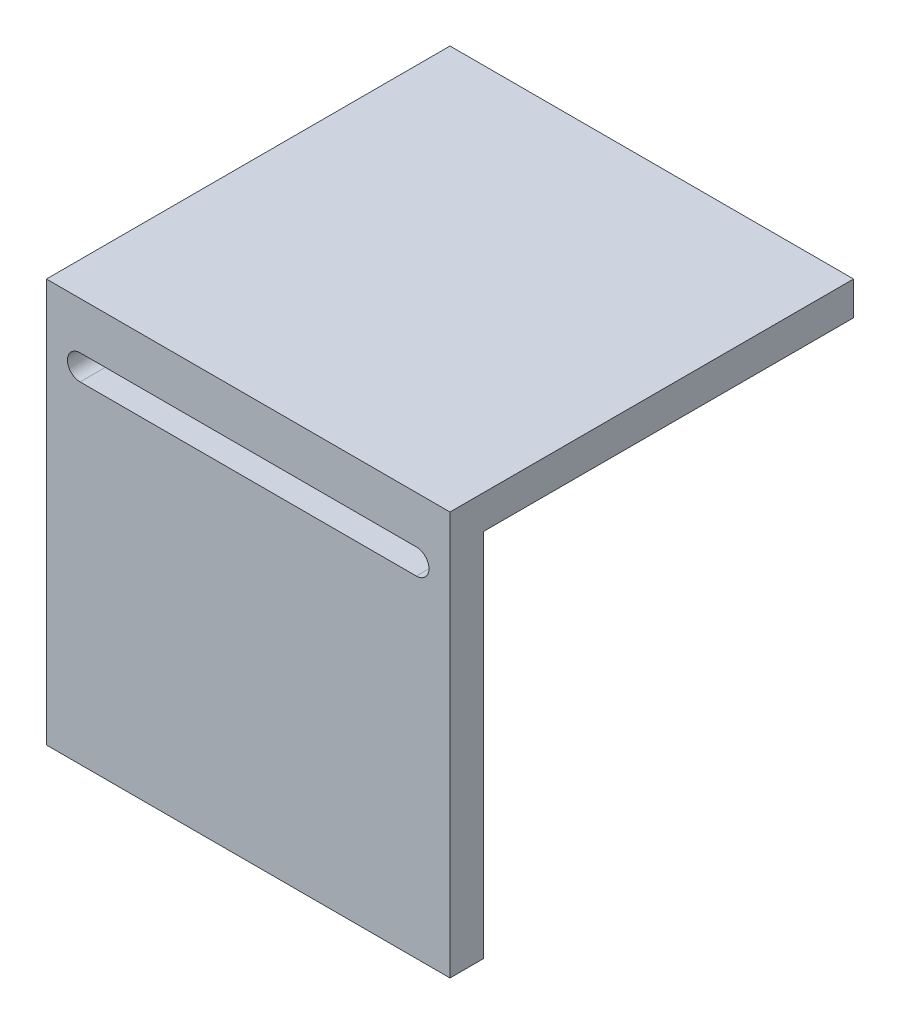
ISO-10303-21;
HEADER;
FILE_DESCRIPTION(('STEP AP214'),'2;1');
FILE_NAME('part.step','',(''),(''),'','','');
FILE_SCHEMA(('AUTOMOTIVE_DESIGN { 1 0 10303 214 1 1 1 1 }'));
ENDSEC;
DATA;
#1=APPLICATION_CONTEXT('core data for automotive mechanical design processes');
#2=APPLICATION_PROTOCOL_DEFINITION('international standard','automotive_design',2000,#1);
#3=PRODUCT_CONTEXT('',#1,'mechanical');
#4=PRODUCT('Part','Part','',(#3));
#5=PRODUCT_RELATED_PRODUCT_CATEGORY('part','',(#4));
#6=PRODUCT_DEFINITION_FORMATION('','',#4);
#7=PRODUCT_DEFINITION_CONTEXT('part definition',#1,'design');
#8=PRODUCT_DEFINITION('design','',#6,#7);
#9=PRODUCT_DEFINITION_SHAPE('','',#8);
#10=(LENGTH_UNIT() NAMED_UNIT(*) SI_UNIT(.MILLI.,.METRE.));
#11=(NAMED_UNIT(*) PLANE_ANGLE_UNIT() SI_UNIT($,.RADIAN.));
#12=(NAMED_UNIT(*) SI_UNIT($,.STERADIAN.) SOLID_ANGLE_UNIT());
#13=UNCERTAINTY_MEASURE_WITH_UNIT(LENGTH_MEASURE(1.E-05),#10,'distance_accuracy_value','');
#14=(GEOMETRIC_REPRESENTATION_CONTEXT(3) GLOBAL_UNCERTAINTY_ASSIGNED_CONTEXT((#13)) GLOBAL_UNIT_ASSIGNED_CONTEXT((#10,
#11,#12)) REPRESENTATION_CONTEXT('',''));
#15=CARTESIAN_POINT('',(0.,0.,0.));
#16=DIRECTION('',(0.,0.,1.));
#17=DIRECTION('',(1.,0.,0.));
#18=AXIS2_PLACEMENT_3D('',#15,#16,#17);
#19=CARTESIAN_POINT('',(76.2,0.,6.35));
#20=DIRECTION('',(0.,0.,-1.));
#21=DIRECTION('',(0.,1.,0.));
#22=AXIS2_PLACEMENT_3D('',#19,#20,#21);
#23=PLANE('',#22);
#24=DIRECTION('',(1.,0.,0.));
#25=VECTOR('',#24,1.);
#26=CARTESIAN_POINT('',(69.85,67.31,6.35));
#27=LINE('',#26,#25);
#28=CARTESIAN_POINT('',(6.35,67.31,6.35));
#29=VERTEX_POINT('',#28);
#30=CARTESIAN_POINT('',(69.85,67.31,6.35));
#31=VERTEX_POINT('',#30);
#32=EDGE_CURVE('E117',#29,#31,#27,.T.);
#33=ORIENTED_EDGE('',*,*,#32,.T.);
#34=CARTESIAN_POINT('',(69.85,64.92875,6.35));
#35=DIRECTION('',(0.,0.,-1.));
#36=DIRECTION('',(0.,1.,0.));
#37=AXIS2_PLACEMENT_3D('',#34,#35,#36);
#38=CIRCLE('',#37,2.38125);
#39=CARTESIAN_POINT('',(69.85,62.5475,6.35));
#40=VERTEX_POINT('',#39);
#41=EDGE_CURVE('E111',#31,#40,#38,.T.);
#42=ORIENTED_EDGE('',*,*,#41,.T.);
#43=DIRECTION('',(-1.,0.,0.));
#44=VECTOR('',#43,1.);
#45=CARTESIAN_POINT('',(69.85,62.5475,6.35));
#46=LINE('',#45,#44);
#47=CARTESIAN_POINT('',(6.35000000000001,62.5475,6.34999999999999));
#48=VERTEX_POINT('',#47);
#49=EDGE_CURVE('E120',#40,#48,#46,.T.);
#50=ORIENTED_EDGE('',*,*,#49,.T.);
#51=CARTESIAN_POINT('',(6.35,64.92875,6.35));
#52=DIRECTION('',(0.,0.,-1.));
#53=DIRECTION('',(0.,1.,0.));
#54=AXIS2_PLACEMENT_3D('',#51,#52,#53);
#55=CIRCLE('',#54,2.38125);
#56=EDGE_CURVE('E47',#48,#29,#55,.T.);
#57=ORIENTED_EDGE('',*,*,#56,.T.);
#58=EDGE_LOOP('',(#33,#42,#50,#57));
#59=FACE_BOUND('',#58,.T.);
#60=DIRECTION('',(0.,-1.,0.));
#61=VECTOR('',#60,1.);
#62=CARTESIAN_POINT('',(0.,0.,6.35));
#63=LINE('',#62,#61);
#64=CARTESIAN_POINT('',(0.,76.2,6.34999999999999));
#65=VERTEX_POINT('',#64);
#66=CARTESIAN_POINT('',(0.,0.,6.35));
#67=VERTEX_POINT('',#66);
#68=EDGE_CURVE('E141',#65,#67,#63,.T.);
#69=ORIENTED_EDGE('',*,*,#68,.T.);
#70=DIRECTION('',(-1.,0.,0.));
#71=VECTOR('',#70,1.);
#72=CARTESIAN_POINT('',(76.2,0.,6.35));
#73=LINE('',#72,#71);
#74=CARTESIAN_POINT('',(76.2,0.,6.35));
#75=VERTEX_POINT('',#74);
#76=EDGE_CURVE('E11',#75,#67,#73,.T.);
#77=ORIENTED_EDGE('',*,*,#76,.F.);
#78=DIRECTION('',(0.,-1.,0.));
#79=VECTOR('',#78,1.);
#80=CARTESIAN_POINT('',(76.2,0.,6.35));
#81=LINE('',#80,#79);
#82=CARTESIAN_POINT('',(76.2,76.2,6.34999999999999));
#83=VERTEX_POINT('',#82);
#84=EDGE_CURVE('E145',#83,#75,#81,.T.);
#85=ORIENTED_EDGE('',*,*,#84,.F.);
#86=DIRECTION('',(-1.,0.,0.));
#87=VECTOR('',#86,1.);
#88=CARTESIAN_POINT('',(76.2,76.2,6.34999999999999));
#89=LINE('',#88,#87);
#90=EDGE_CURVE('E159',#83,#65,#89,.T.);
#91=ORIENTED_EDGE('',*,*,#90,.T.);
#92=EDGE_LOOP('',(#69,#77,#85,#91));
#93=FACE_BOUND('',#92,.T.);
#94=ADVANCED_FACE('F33',(#59,#93),#23,.F.);
#95=CARTESIAN_POINT('',(76.2,0.,0.));
#96=DIRECTION('',(0.,1.,0.));
#97=DIRECTION('',(0.,0.,1.));
#98=AXIS2_PLACEMENT_3D('',#95,#96,#97);
#99=PLANE('',#98);
#100=DIRECTION('',(0.,0.,-1.));
#101=VECTOR('',#100,1.);
#102=CARTESIAN_POINT('',(0.,0.,0.));
#103=LINE('',#102,#101);
#104=CARTESIAN_POINT('',(0.,0.,0.));
#105=VERTEX_POINT('',#104);
#106=EDGE_CURVE('E162',#67,#105,#103,.T.);
#107=ORIENTED_EDGE('',*,*,#106,.T.);
#108=DIRECTION('',(-1.,0.,0.));
#109=VECTOR('',#108,1.);
#110=CARTESIAN_POINT('',(76.2,0.,0.));
#111=LINE('',#110,#109);
#112=CARTESIAN_POINT('',(76.2,0.,0.));
#113=VERTEX_POINT('',#112);
#114=EDGE_CURVE('E40',#113,#105,#111,.T.);
#115=ORIENTED_EDGE('',*,*,#114,.F.);
#116=DIRECTION('',(0.,0.,-1.));
#117=VECTOR('',#116,1.);
#118=CARTESIAN_POINT('',(76.2,0.,0.));
#119=LINE('',#118,#117);
#120=EDGE_CURVE('E148',#75,#113,#119,.T.);
#121=ORIENTED_EDGE('',*,*,#120,.F.);
#122=ORIENTED_EDGE('',*,*,#76,.T.);
#123=EDGE_LOOP('',(#107,#115,#121,#122));
#124=FACE_BOUND('',#123,.T.);
#125=ADVANCED_FACE('F209',(#124),#99,.F.);
#126=CARTESIAN_POINT('',(76.2,69.85,0.));
#127=DIRECTION('',(0.,0.,1.));
#128=DIRECTION('',(0.,-1.,0.));
#129=AXIS2_PLACEMENT_3D('',#126,#127,#128);
#130=PLANE('',#129);
#131=DIRECTION('',(-1.,0.,0.));
#132=VECTOR('',#131,1.);
#133=CARTESIAN_POINT('',(69.85,62.5475,0.));
#134=LINE('',#133,#132);
#135=CARTESIAN_POINT('',(69.85,62.5475,0.));
#136=VERTEX_POINT('',#135);
#137=CARTESIAN_POINT('',(6.35,62.5475,0.));
#138=VERTEX_POINT('',#137);
#139=EDGE_CURVE('E135',#136,#138,#134,.T.);
#140=ORIENTED_EDGE('',*,*,#139,.F.);
#141=CARTESIAN_POINT('',(69.85,64.92875,0.));
#142=DIRECTION('',(0.,0.,-1.));
#143=DIRECTION('',(0.,1.,0.));
#144=AXIS2_PLACEMENT_3D('',#141,#142,#143);
#145=CIRCLE('',#144,2.38125);
#146=CARTESIAN_POINT('',(69.85,67.31,0.));
#147=VERTEX_POINT('',#146);
#148=EDGE_CURVE('E55',#147,#136,#145,.T.);
#149=ORIENTED_EDGE('',*,*,#148,.F.);
#150=DIRECTION('',(1.,0.,0.));
#151=VECTOR('',#150,1.);
#152=CARTESIAN_POINT('',(69.85,67.31,0.));
#153=LINE('',#152,#151);
#154=CARTESIAN_POINT('',(6.35,67.31,0.));
#155=VERTEX_POINT('',#154);
#156=EDGE_CURVE('E126',#155,#147,#153,.T.);
#157=ORIENTED_EDGE('',*,*,#156,.F.);
#158=CARTESIAN_POINT('',(6.35,64.92875,0.));
#159=DIRECTION('',(0.,0.,-1.));
#160=DIRECTION('',(0.,1.,0.));
#161=AXIS2_PLACEMENT_3D('',#158,#159,#160);
#162=CIRCLE('',#161,2.38125);
#163=EDGE_CURVE('E129',#138,#155,#162,.T.);
#164=ORIENTED_EDGE('',*,*,#163,.F.);
#165=EDGE_LOOP('',(#140,#149,#157,#164));
#166=FACE_BOUND('',#165,.T.);
#167=DIRECTION('',(0.,1.,0.));
#168=VECTOR('',#167,1.);
#169=CARTESIAN_POINT('',(0.,69.85,0.));
#170=LINE('',#169,#168);
#171=CARTESIAN_POINT('',(0.,69.85,0.));
#172=VERTEX_POINT('',#171);
#173=EDGE_CURVE('E164',#105,#172,#170,.T.);
#174=ORIENTED_EDGE('',*,*,#173,.T.);
#175=DIRECTION('',(-1.,0.,0.));
#176=VECTOR('',#175,1.);
#177=CARTESIAN_POINT('',(76.2,69.85,0.));
#178=LINE('',#177,#176);
#179=CARTESIAN_POINT('',(76.2,69.85,0.));
#180=VERTEX_POINT('',#179);
#181=EDGE_CURVE('E179',#180,#172,#178,.T.);
#182=ORIENTED_EDGE('',*,*,#181,.F.);
#183=DIRECTION('',(0.,1.,0.));
#184=VECTOR('',#183,1.);
#185=CARTESIAN_POINT('',(76.2,69.85,0.));
#186=LINE('',#185,#184);
#187=EDGE_CURVE('E151',#113,#180,#186,.T.);
#188=ORIENTED_EDGE('',*,*,#187,.F.);
#189=ORIENTED_EDGE('',*,*,#114,.T.);
#190=EDGE_LOOP('',(#174,#182,#188,#189));
#191=FACE_BOUND('',#190,.T.);
#192=ADVANCED_FACE('F186',(#166,#191),#130,.F.);
#193=CARTESIAN_POINT('',(76.2,69.85,-69.85));
#194=DIRECTION('',(0.,1.,0.));
#195=DIRECTION('',(0.,0.,1.));
#196=AXIS2_PLACEMENT_3D('',#193,#194,#195);
#197=PLANE('',#196);
#198=DIRECTION('',(0.,0.,-1.));
#199=VECTOR('',#198,1.);
#200=CARTESIAN_POINT('',(0.,69.85,-69.85));
#201=LINE('',#200,#199);
#202=CARTESIAN_POINT('',(0.,69.85,-69.85));
#203=VERTEX_POINT('',#202);
#204=EDGE_CURVE('E166',#172,#203,#201,.T.);
#205=ORIENTED_EDGE('',*,*,#204,.T.);
#206=DIRECTION('',(-1.,0.,0.));
#207=VECTOR('',#206,1.);
#208=CARTESIAN_POINT('',(76.2,69.85,-69.85));
#209=LINE('',#208,#207);
#210=CARTESIAN_POINT('',(76.2,69.85,-69.85));
#211=VERTEX_POINT('',#210);
#212=EDGE_CURVE('E176',#211,#203,#209,.T.);
#213=ORIENTED_EDGE('',*,*,#212,.F.);
#214=DIRECTION('',(0.,0.,-1.));
#215=VECTOR('',#214,1.);
#216=CARTESIAN_POINT('',(76.2,69.85,-69.85));
#217=LINE('',#216,#215);
#218=EDGE_CURVE('E153',#180,#211,#217,.T.);
#219=ORIENTED_EDGE('',*,*,#218,.F.);
#220=ORIENTED_EDGE('',*,*,#181,.T.);
#221=EDGE_LOOP('',(#205,#213,#219,#220));
#222=FACE_BOUND('',#221,.T.);
#223=ADVANCED_FACE('F197',(#222),#197,.F.);
#224=CARTESIAN_POINT('',(76.2,76.2,-69.85));
#225=DIRECTION('',(0.,0.,1.));
#226=DIRECTION('',(0.,-1.,0.));
#227=AXIS2_PLACEMENT_3D('',#224,#225,#226);
#228=PLANE('',#227);
#229=DIRECTION('',(0.,1.,0.));
#230=VECTOR('',#229,1.);
#231=CARTESIAN_POINT('',(0.,76.2,-69.85));
#232=LINE('',#231,#230);
#233=CARTESIAN_POINT('',(0.,76.2,-69.85));
#234=VERTEX_POINT('',#233);
#235=EDGE_CURVE('E168',#203,#234,#232,.T.);
#236=ORIENTED_EDGE('',*,*,#235,.T.);
#237=DIRECTION('',(-1.,0.,0.));
#238=VECTOR('',#237,1.);
#239=CARTESIAN_POINT('',(76.2,76.2,-69.85));
#240=LINE('',#239,#238);
#241=CARTESIAN_POINT('',(76.2,76.2,-69.85));
#242=VERTEX_POINT('',#241);
#243=EDGE_CURVE('E173',#242,#234,#240,.T.);
#244=ORIENTED_EDGE('',*,*,#243,.F.);
#245=DIRECTION('',(0.,1.,0.));
#246=VECTOR('',#245,1.);
#247=CARTESIAN_POINT('',(76.2,76.2,-69.85));
#248=LINE('',#247,#246);
#249=EDGE_CURVE('E155',#211,#242,#248,.T.);
#250=ORIENTED_EDGE('',*,*,#249,.F.);
#251=ORIENTED_EDGE('',*,*,#212,.T.);
#252=EDGE_LOOP('',(#236,#244,#250,#251));
#253=FACE_BOUND('',#252,.T.);
#254=ADVANCED_FACE('F201',(#253),#228,.F.);
#255=CARTESIAN_POINT('',(76.2,76.2,6.34999999999999));
#256=DIRECTION('',(0.,-1.,0.));
#257=DIRECTION('',(0.,0.,-1.));
#258=AXIS2_PLACEMENT_3D('',#255,#256,#257);
#259=PLANE('',#258);
#260=DIRECTION('',(0.,0.,1.));
#261=VECTOR('',#260,1.);
#262=CARTESIAN_POINT('',(0.,76.2,6.34999999999999));
#263=LINE('',#262,#261);
#264=EDGE_CURVE('E149',#234,#65,#263,.T.);
#265=ORIENTED_EDGE('',*,*,#264,.T.);
#266=ORIENTED_EDGE('',*,*,#90,.F.);
#267=DIRECTION('',(0.,0.,1.));
#268=VECTOR('',#267,1.);
#269=CARTESIAN_POINT('',(76.2,76.2,6.34999999999999));
#270=LINE('',#269,#268);
#271=EDGE_CURVE('E157',#242,#83,#270,.T.);
#272=ORIENTED_EDGE('',*,*,#271,.F.);
#273=ORIENTED_EDGE('',*,*,#243,.T.);
#274=EDGE_LOOP('',(#265,#266,#272,#273));
#275=FACE_BOUND('',#274,.T.);
#276=ADVANCED_FACE('F211',(#275),#259,.F.);
#277=CARTESIAN_POINT('',(76.2,0.,0.));
#278=DIRECTION('',(-1.,0.,0.));
#279=DIRECTION('',(0.,0.,1.));
#280=AXIS2_PLACEMENT_3D('',#277,#278,#279);
#281=PLANE('',#280);
#282=ORIENTED_EDGE('',*,*,#84,.T.);
#283=ORIENTED_EDGE('',*,*,#120,.T.);
#284=ORIENTED_EDGE('',*,*,#187,.T.);
#285=ORIENTED_EDGE('',*,*,#218,.T.);
#286=ORIENTED_EDGE('',*,*,#249,.T.);
#287=ORIENTED_EDGE('',*,*,#271,.T.);
#288=EDGE_LOOP('',(#282,#283,#284,#285,#286,#287));
#289=FACE_BOUND('',#288,.T.);
#290=ADVANCED_FACE('F205',(#289),#281,.F.);
#291=CARTESIAN_POINT('',(0.,0.,0.));
#292=DIRECTION('',(-1.,0.,0.));
#293=DIRECTION('',(0.,0.,1.));
#294=AXIS2_PLACEMENT_3D('',#291,#292,#293);
#295=PLANE('',#294);
#296=ORIENTED_EDGE('',*,*,#68,.F.);
#297=ORIENTED_EDGE('',*,*,#264,.F.);
#298=ORIENTED_EDGE('',*,*,#235,.F.);
#299=ORIENTED_EDGE('',*,*,#204,.F.);
#300=ORIENTED_EDGE('',*,*,#173,.F.);
#301=ORIENTED_EDGE('',*,*,#106,.F.);
#302=EDGE_LOOP('',(#296,#297,#298,#299,#300,#301));
#303=FACE_BOUND('',#302,.T.);
#304=ADVANCED_FACE('F192',(#303),#295,.T.);
#305=CARTESIAN_POINT('',(69.85,64.92875,6.35));
#306=DIRECTION('',(0.,0.,-1.));
#307=DIRECTION('',(0.,1.,0.));
#308=AXIS2_PLACEMENT_3D('',#305,#306,#307);
#309=CYLINDRICAL_SURFACE('',#308,2.38125);
#310=ORIENTED_EDGE('',*,*,#148,.T.);
#311=DIRECTION('',(0.,0.,-1.));
#312=VECTOR('',#311,1.);
#313=CARTESIAN_POINT('',(69.85,62.5475,6.35));
#314=LINE('',#313,#312);
#315=EDGE_CURVE('E107',#40,#136,#314,.T.);
#316=ORIENTED_EDGE('',*,*,#315,.F.);
#317=ORIENTED_EDGE('',*,*,#41,.F.);
#318=DIRECTION('',(0.,0.,-1.));
#319=VECTOR('',#318,1.);
#320=CARTESIAN_POINT('',(69.85,67.31,6.35));
#321=LINE('',#320,#319);
#322=EDGE_CURVE('E139',#31,#147,#321,.T.);
#323=ORIENTED_EDGE('',*,*,#322,.T.);
#324=EDGE_LOOP('',(#310,#316,#317,#323));
#325=FACE_BOUND('',#324,.T.);
#326=ADVANCED_FACE('F109',(#325),#309,.F.);
#327=CARTESIAN_POINT('',(69.85,67.31,6.35));
#328=DIRECTION('',(0.,1.,0.));
#329=DIRECTION('',(0.,0.,1.));
#330=AXIS2_PLACEMENT_3D('',#327,#328,#329);
#331=PLANE('',#330);
#332=ORIENTED_EDGE('',*,*,#156,.T.);
#333=ORIENTED_EDGE('',*,*,#322,.F.);
#334=ORIENTED_EDGE('',*,*,#32,.F.);
#335=DIRECTION('',(0.,0.,-1.));
#336=VECTOR('',#335,1.);
#337=CARTESIAN_POINT('',(6.35,67.31,6.35));
#338=LINE('',#337,#336);
#339=EDGE_CURVE('E142',#29,#155,#338,.T.);
#340=ORIENTED_EDGE('',*,*,#339,.T.);
#341=EDGE_LOOP('',(#332,#333,#334,#340));
#342=FACE_BOUND('',#341,.T.);
#343=ADVANCED_FACE('F275',(#342),#331,.F.);
#344=CARTESIAN_POINT('',(6.35,64.92875,6.35));
#345=DIRECTION('',(0.,0.,-1.));
#346=DIRECTION('',(0.,1.,0.));
#347=AXIS2_PLACEMENT_3D('',#344,#345,#346);
#348=CYLINDRICAL_SURFACE('',#347,2.38125);
#349=ORIENTED_EDGE('',*,*,#163,.T.);
#350=ORIENTED_EDGE('',*,*,#339,.F.);
#351=ORIENTED_EDGE('',*,*,#56,.F.);
#352=DIRECTION('',(0.,0.,-1.));
#353=VECTOR('',#352,1.);
#354=CARTESIAN_POINT('',(6.35,62.5475,6.35));
#355=LINE('',#354,#353);
#356=EDGE_CURVE('E116',#48,#138,#355,.T.);
#357=ORIENTED_EDGE('',*,*,#356,.T.);
#358=EDGE_LOOP('',(#349,#350,#351,#357));
#359=FACE_BOUND('',#358,.T.);
#360=ADVANCED_FACE('F284',(#359),#348,.F.);
#361=CARTESIAN_POINT('',(69.85,62.5475,6.35));
#362=DIRECTION('',(0.,-1.,0.));
#363=DIRECTION('',(0.,0.,-1.));
#364=AXIS2_PLACEMENT_3D('',#361,#362,#363);
#365=PLANE('',#364);
#366=ORIENTED_EDGE('',*,*,#139,.T.);
#367=ORIENTED_EDGE('',*,*,#356,.F.);
#368=ORIENTED_EDGE('',*,*,#49,.F.);
#369=ORIENTED_EDGE('',*,*,#315,.T.);
#370=EDGE_LOOP('',(#366,#367,#368,#369));
#371=FACE_BOUND('',#370,.T.);
#372=ADVANCED_FACE('F121',(#371),#365,.F.);
#373=CLOSED_SHELL('',(#94,#125,#192,#223,#254,#276,#290,#304,#326,#343,#360,#372));
#374=MANIFOLD_SOLID_BREP('B2',#373);
#375=ADVANCED_BREP_SHAPE_REPRESENTATION('',(#18,#374),#14);
#376=SHAPE_DEFINITION_REPRESENTATION(#9,#375);
ENDSEC;
END-ISO-10303-21;
